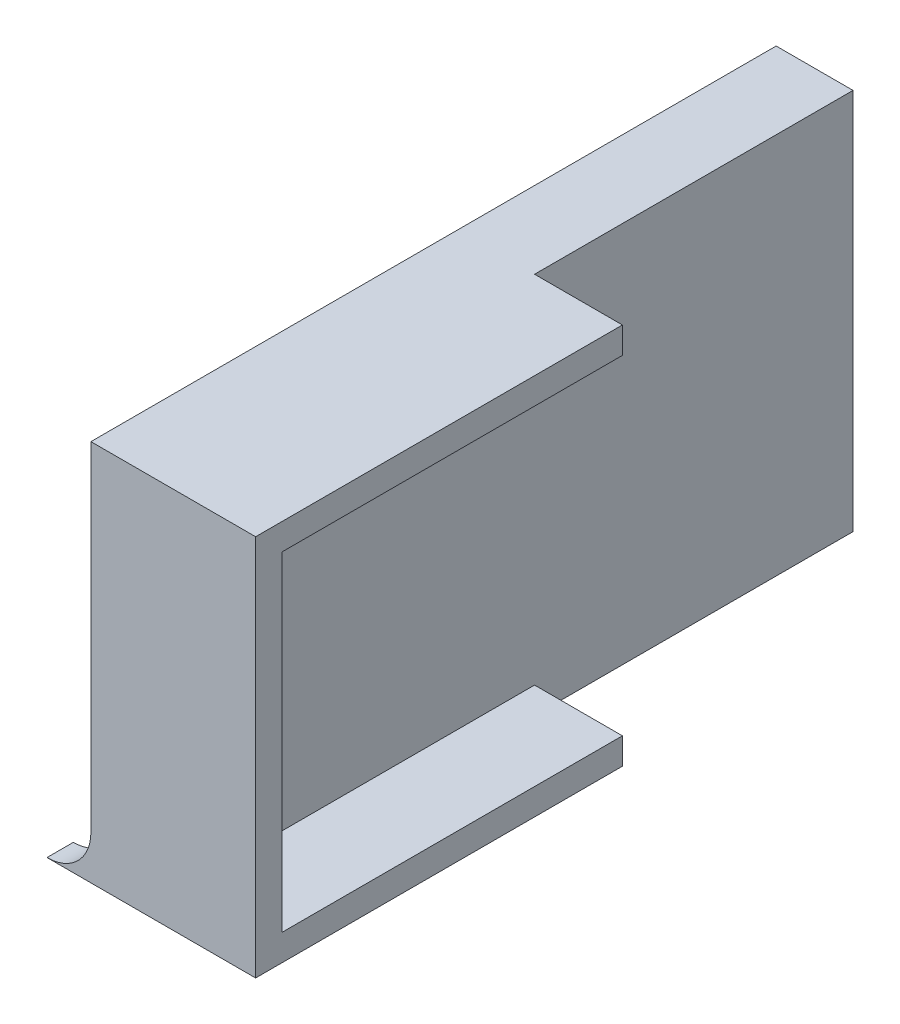
ISO-10303-21;
HEADER;
FILE_DESCRIPTION(('STEP AP214'),'2;1');
FILE_NAME('part.step','',(''),(''),'','','');
FILE_SCHEMA(('AUTOMOTIVE_DESIGN { 1 0 10303 214 1 1 1 1 }'));
ENDSEC;
DATA;
#1=APPLICATION_CONTEXT('core data for automotive mechanical design processes');
#2=APPLICATION_PROTOCOL_DEFINITION('international standard','automotive_design',2000,#1);
#3=PRODUCT_CONTEXT('',#1,'mechanical');
#4=PRODUCT('Part','Part','',(#3));
#5=PRODUCT_RELATED_PRODUCT_CATEGORY('part','',(#4));
#6=PRODUCT_DEFINITION_FORMATION('','',#4);
#7=PRODUCT_DEFINITION_CONTEXT('part definition',#1,'design');
#8=PRODUCT_DEFINITION('design','',#6,#7);
#9=PRODUCT_DEFINITION_SHAPE('','',#8);
#10=(LENGTH_UNIT() NAMED_UNIT(*) SI_UNIT(.MILLI.,.METRE.));
#11=(NAMED_UNIT(*) PLANE_ANGLE_UNIT() SI_UNIT($,.RADIAN.));
#12=(NAMED_UNIT(*) SI_UNIT($,.STERADIAN.) SOLID_ANGLE_UNIT());
#13=UNCERTAINTY_MEASURE_WITH_UNIT(LENGTH_MEASURE(1.E-05),#10,'distance_accuracy_value','');
#14=(GEOMETRIC_REPRESENTATION_CONTEXT(3) GLOBAL_UNCERTAINTY_ASSIGNED_CONTEXT((#13)) GLOBAL_UNIT_ASSIGNED_CONTEXT((#10,
#11,#12)) REPRESENTATION_CONTEXT('',''));
#15=CARTESIAN_POINT('',(0.,0.,0.));
#16=DIRECTION('',(0.,0.,1.));
#17=DIRECTION('',(1.,0.,0.));
#18=AXIS2_PLACEMENT_3D('',#15,#16,#17);
#19=CARTESIAN_POINT('',(0.,0.,-2.8));
#20=DIRECTION('',(0.,0.,-1.));
#21=DIRECTION('',(-1.,0.,0.));
#22=AXIS2_PLACEMENT_3D('',#19,#20,#21);
#23=PLANE('',#22);
#24=CARTESIAN_POINT('',(-118.5,65.8,-2.8));
#25=DIRECTION('',(0.,0.,-1.));
#26=DIRECTION('',(-1.,0.,0.));
#27=AXIS2_PLACEMENT_3D('',#24,#25,#26);
#28=CIRCLE('',#27,2.);
#29=CARTESIAN_POINT('',(-118.5,63.8,-2.8));
#30=VERTEX_POINT('',#29);
#31=CARTESIAN_POINT('',(-116.5,65.8,-2.8));
#32=VERTEX_POINT('',#31);
#33=EDGE_CURVE('E145',#30,#32,#28,.F.);
#34=ORIENTED_EDGE('',*,*,#33,.F.);
#35=DIRECTION('',(-1.,0.,0.));
#36=VECTOR('',#35,1.);
#37=CARTESIAN_POINT('',(-118.5,63.8,-2.8));
#38=LINE('',#37,#36);
#39=CARTESIAN_POINT('',(-109.,63.8,-2.8));
#40=VERTEX_POINT('',#39);
#41=EDGE_CURVE('E173',#40,#30,#38,.T.);
#42=ORIENTED_EDGE('',*,*,#41,.F.);
#43=DIRECTION('',(0.,-1.,0.));
#44=VECTOR('',#43,1.);
#45=CARTESIAN_POINT('',(-109.,63.8,-2.8));
#46=LINE('',#45,#44);
#47=CARTESIAN_POINT('',(-109.,81.2,-2.8));
#48=VERTEX_POINT('',#47);
#49=EDGE_CURVE('E183',#48,#40,#46,.T.);
#50=ORIENTED_EDGE('',*,*,#49,.F.);
#51=DIRECTION('',(1.,0.,0.));
#52=VECTOR('',#51,1.);
#53=CARTESIAN_POINT('',(-118.5,81.2,-2.8));
#54=LINE('',#53,#52);
#55=CARTESIAN_POINT('',(-116.5,81.2,-2.8));
#56=VERTEX_POINT('',#55);
#57=EDGE_CURVE('E180',#56,#48,#54,.T.);
#58=ORIENTED_EDGE('',*,*,#57,.F.);
#59=DIRECTION('',(0.,-1.,0.));
#60=VECTOR('',#59,1.);
#61=CARTESIAN_POINT('',(-116.5,84.,-2.8));
#62=LINE('',#61,#60);
#63=EDGE_CURVE('E195',#56,#32,#62,.T.);
#64=ORIENTED_EDGE('',*,*,#63,.T.);
#65=EDGE_LOOP('',(#34,#42,#50,#58,#64));
#66=FACE_BOUND('',#65,.T.);
#67=ADVANCED_FACE('F35',(#66),#23,.F.);
#68=CARTESIAN_POINT('',(-109.,63.8,-2.8));
#69=DIRECTION('',(0.,-1.,0.));
#70=DIRECTION('',(-1.,0.,0.));
#71=AXIS2_PLACEMENT_3D('',#68,#69,#70);
#72=PLANE('',#71);
#73=DIRECTION('',(-1.,0.,0.));
#74=VECTOR('',#73,1.);
#75=CARTESIAN_POINT('',(0.,63.8,-4.));
#76=LINE('',#75,#74);
#77=CARTESIAN_POINT('',(-116.5,63.8,-4.));
#78=VERTEX_POINT('',#77);
#79=CARTESIAN_POINT('',(-118.5,63.8,-4.));
#80=VERTEX_POINT('',#79);
#81=EDGE_CURVE('E193',#78,#80,#76,.T.);
#82=ORIENTED_EDGE('',*,*,#81,.F.);
#83=DIRECTION('',(0.,0.,1.));
#84=VECTOR('',#83,1.);
#85=CARTESIAN_POINT('',(-116.5,63.8,-34.));
#86=LINE('',#85,#84);
#87=CARTESIAN_POINT('',(-116.5,63.8,-34.));
#88=VERTEX_POINT('',#87);
#89=EDGE_CURVE('E167',#88,#78,#86,.T.);
#90=ORIENTED_EDGE('',*,*,#89,.F.);
#91=DIRECTION('',(1.,0.,0.));
#92=VECTOR('',#91,1.);
#93=CARTESIAN_POINT('',(-125.,63.8,-34.));
#94=LINE('',#93,#92);
#95=CARTESIAN_POINT('',(-113.,63.8,-34.));
#96=VERTEX_POINT('',#95);
#97=EDGE_CURVE('E246',#88,#96,#94,.T.);
#98=ORIENTED_EDGE('',*,*,#97,.T.);
#99=DIRECTION('',(0.,0.,1.));
#100=VECTOR('',#99,1.);
#101=CARTESIAN_POINT('',(-113.,63.8,-46.0598507453451));
#102=LINE('',#101,#100);
#103=CARTESIAN_POINT('',(-113.,63.8,-19.5));
#104=VERTEX_POINT('',#103);
#105=EDGE_CURVE('E249',#96,#104,#102,.T.);
#106=ORIENTED_EDGE('',*,*,#105,.T.);
#107=DIRECTION('',(-1.,0.,0.));
#108=VECTOR('',#107,1.);
#109=CARTESIAN_POINT('',(-125.,63.8,-19.5));
#110=LINE('',#109,#108);
#111=CARTESIAN_POINT('',(-109.,63.8,-19.5));
#112=VERTEX_POINT('',#111);
#113=EDGE_CURVE('E245',#112,#104,#110,.T.);
#114=ORIENTED_EDGE('',*,*,#113,.F.);
#115=DIRECTION('',(0.,0.,-1.));
#116=VECTOR('',#115,1.);
#117=CARTESIAN_POINT('',(-109.,63.8,-18.4));
#118=LINE('',#117,#116);
#119=EDGE_CURVE('E11',#40,#112,#118,.T.);
#120=ORIENTED_EDGE('',*,*,#119,.F.);
#121=ORIENTED_EDGE('',*,*,#41,.T.);
#122=DIRECTION('',(0.,0.,-1.));
#123=VECTOR('',#122,1.);
#124=CARTESIAN_POINT('',(-118.5,63.8,0.));
#125=LINE('',#124,#123);
#126=EDGE_CURVE('E197',#30,#80,#125,.T.);
#127=ORIENTED_EDGE('',*,*,#126,.T.);
#128=EDGE_LOOP('',(#82,#90,#98,#106,#114,#120,#121,#127));
#129=FACE_BOUND('',#128,.T.);
#130=ADVANCED_FACE('F206',(#129),#72,.T.);
#131=CARTESIAN_POINT('',(-109.,81.2,-2.8));
#132=DIRECTION('',(1.,0.,0.));
#133=DIRECTION('',(0.,-1.,0.));
#134=AXIS2_PLACEMENT_3D('',#131,#132,#133);
#135=PLANE('',#134);
#136=DIRECTION('',(0.,-1.,0.));
#137=VECTOR('',#136,1.);
#138=CARTESIAN_POINT('',(-109.,0.,-4.));
#139=LINE('',#138,#137);
#140=CARTESIAN_POINT('',(-109.,80.,-4.));
#141=VERTEX_POINT('',#140);
#142=CARTESIAN_POINT('',(-109.,65.,-4.));
#143=VERTEX_POINT('',#142);
#144=EDGE_CURVE('E190',#141,#143,#139,.T.);
#145=ORIENTED_EDGE('',*,*,#144,.F.);
#146=DIRECTION('',(0.,0.,1.));
#147=VECTOR('',#146,1.);
#148=CARTESIAN_POINT('',(-109.,80.,-19.5));
#149=LINE('',#148,#147);
#150=CARTESIAN_POINT('',(-109.,80.,-19.5));
#151=VERTEX_POINT('',#150);
#152=EDGE_CURVE('E270',#151,#141,#149,.T.);
#153=ORIENTED_EDGE('',*,*,#152,.F.);
#154=DIRECTION('',(0.,-1.,0.));
#155=VECTOR('',#154,1.);
#156=CARTESIAN_POINT('',(-109.,81.2,-19.5));
#157=LINE('',#156,#155);
#158=CARTESIAN_POINT('',(-109.,81.2,-19.5));
#159=VERTEX_POINT('',#158);
#160=EDGE_CURVE('E265',#159,#151,#157,.T.);
#161=ORIENTED_EDGE('',*,*,#160,.F.);
#162=DIRECTION('',(0.,0.,-1.));
#163=VECTOR('',#162,1.);
#164=CARTESIAN_POINT('',(-109.,81.2,-18.4));
#165=LINE('',#164,#163);
#166=EDGE_CURVE('E45',#48,#159,#165,.T.);
#167=ORIENTED_EDGE('',*,*,#166,.F.);
#168=ORIENTED_EDGE('',*,*,#49,.T.);
#169=ORIENTED_EDGE('',*,*,#119,.T.);
#170=DIRECTION('',(0.,-1.,0.));
#171=VECTOR('',#170,1.);
#172=CARTESIAN_POINT('',(-109.,65.,-19.5));
#173=LINE('',#172,#171);
#174=CARTESIAN_POINT('',(-109.,65.,-19.5));
#175=VERTEX_POINT('',#174);
#176=EDGE_CURVE('E255',#175,#112,#173,.T.);
#177=ORIENTED_EDGE('',*,*,#176,.F.);
#178=DIRECTION('',(0.,0.,1.));
#179=VECTOR('',#178,1.);
#180=CARTESIAN_POINT('',(-109.,65.,-19.5));
#181=LINE('',#180,#179);
#182=EDGE_CURVE('E157',#175,#143,#181,.T.);
#183=ORIENTED_EDGE('',*,*,#182,.T.);
#184=EDGE_LOOP('',(#145,#153,#161,#167,#168,#169,#177,#183));
#185=FACE_BOUND('',#184,.T.);
#186=ADVANCED_FACE('F315',(#185),#135,.T.);
#187=CARTESIAN_POINT('',(-118.5,81.2,-2.8));
#188=DIRECTION('',(0.,1.,0.));
#189=DIRECTION('',(1.,0.,0.));
#190=AXIS2_PLACEMENT_3D('',#187,#188,#189);
#191=PLANE('',#190);
#192=ORIENTED_EDGE('',*,*,#166,.T.);
#193=DIRECTION('',(1.,0.,0.));
#194=VECTOR('',#193,1.);
#195=CARTESIAN_POINT('',(-125.,81.2,-19.5));
#196=LINE('',#195,#194);
#197=CARTESIAN_POINT('',(-113.,81.2,-19.5));
#198=VERTEX_POINT('',#197);
#199=EDGE_CURVE('E267',#198,#159,#196,.T.);
#200=ORIENTED_EDGE('',*,*,#199,.F.);
#201=DIRECTION('',(0.,0.,1.));
#202=VECTOR('',#201,1.);
#203=CARTESIAN_POINT('',(-113.,81.2,-46.0598507453451));
#204=LINE('',#203,#202);
#205=CARTESIAN_POINT('',(-113.,81.2,-34.));
#206=VERTEX_POINT('',#205);
#207=EDGE_CURVE('E240',#206,#198,#204,.T.);
#208=ORIENTED_EDGE('',*,*,#207,.F.);
#209=DIRECTION('',(-1.,0.,0.));
#210=VECTOR('',#209,1.);
#211=CARTESIAN_POINT('',(-125.,81.2,-34.));
#212=LINE('',#211,#210);
#213=CARTESIAN_POINT('',(-116.5,81.2,-34.));
#214=VERTEX_POINT('',#213);
#215=EDGE_CURVE('E233',#206,#214,#212,.T.);
#216=ORIENTED_EDGE('',*,*,#215,.T.);
#217=DIRECTION('',(0.,0.,-1.));
#218=VECTOR('',#217,1.);
#219=CARTESIAN_POINT('',(-116.5,81.2,-19.5));
#220=LINE('',#219,#218);
#221=EDGE_CURVE('E166',#56,#214,#220,.T.);
#222=ORIENTED_EDGE('',*,*,#221,.F.);
#223=ORIENTED_EDGE('',*,*,#57,.T.);
#224=EDGE_LOOP('',(#192,#200,#208,#216,#222,#223));
#225=FACE_BOUND('',#224,.T.);
#226=ADVANCED_FACE('F332',(#225),#191,.T.);
#227=CARTESIAN_POINT('',(0.,0.,-19.5));
#228=DIRECTION('',(0.,0.,-1.));
#229=DIRECTION('',(1.,0.,0.));
#230=AXIS2_PLACEMENT_3D('',#227,#228,#229);
#231=PLANE('',#230);
#232=ORIENTED_EDGE('',*,*,#113,.T.);
#233=DIRECTION('',(0.,-1.,0.));
#234=VECTOR('',#233,1.);
#235=CARTESIAN_POINT('',(-113.,63.8,-19.5));
#236=LINE('',#235,#234);
#237=CARTESIAN_POINT('',(-113.,65.,-19.5));
#238=VERTEX_POINT('',#237);
#239=EDGE_CURVE('E236',#238,#104,#236,.T.);
#240=ORIENTED_EDGE('',*,*,#239,.F.);
#241=DIRECTION('',(1.,0.,0.));
#242=VECTOR('',#241,1.);
#243=CARTESIAN_POINT('',(-125.,65.,-19.5));
#244=LINE('',#243,#242);
#245=EDGE_CURVE('E258',#238,#175,#244,.T.);
#246=ORIENTED_EDGE('',*,*,#245,.T.);
#247=ORIENTED_EDGE('',*,*,#176,.T.);
#248=EDGE_LOOP('',(#232,#240,#246,#247));
#249=FACE_BOUND('',#248,.T.);
#250=ADVANCED_FACE('F311',(#249),#231,.T.);
#251=CARTESIAN_POINT('',(0.,0.,-19.5));
#252=DIRECTION('',(0.,0.,-1.));
#253=DIRECTION('',(1.,0.,0.));
#254=AXIS2_PLACEMENT_3D('',#251,#252,#253);
#255=PLANE('',#254);
#256=DIRECTION('',(-1.,0.,0.));
#257=VECTOR('',#256,1.);
#258=CARTESIAN_POINT('',(-125.,80.,-19.5));
#259=LINE('',#258,#257);
#260=CARTESIAN_POINT('',(-113.,80.,-19.5));
#261=VERTEX_POINT('',#260);
#262=EDGE_CURVE('E262',#151,#261,#259,.T.);
#263=ORIENTED_EDGE('',*,*,#262,.T.);
#264=DIRECTION('',(0.,-1.,0.));
#265=VECTOR('',#264,1.);
#266=CARTESIAN_POINT('',(-113.,81.2,-19.5));
#267=LINE('',#266,#265);
#268=EDGE_CURVE('E232',#198,#261,#267,.T.);
#269=ORIENTED_EDGE('',*,*,#268,.F.);
#270=ORIENTED_EDGE('',*,*,#199,.T.);
#271=ORIENTED_EDGE('',*,*,#160,.T.);
#272=EDGE_LOOP('',(#263,#269,#270,#271));
#273=FACE_BOUND('',#272,.T.);
#274=ADVANCED_FACE('F328',(#273),#255,.T.);
#275=CARTESIAN_POINT('',(-115.,80.,-34.));
#276=DIRECTION('',(-1.,0.,0.));
#277=DIRECTION('',(0.,0.,1.));
#278=AXIS2_PLACEMENT_3D('',#275,#276,#277);
#279=PLANE('',#278);
#280=DIRECTION('',(0.,0.,1.));
#281=VECTOR('',#280,1.);
#282=CARTESIAN_POINT('',(-115.,65.,-34.));
#283=LINE('',#282,#281);
#284=CARTESIAN_POINT('',(-115.,65.,-34.));
#285=VERTEX_POINT('',#284);
#286=CARTESIAN_POINT('',(-115.,65.,-4.));
#287=VERTEX_POINT('',#286);
#288=EDGE_CURVE('E281',#285,#287,#283,.T.);
#289=ORIENTED_EDGE('',*,*,#288,.T.);
#290=DIRECTION('',(0.,1.,0.));
#291=VECTOR('',#290,1.);
#292=CARTESIAN_POINT('',(-115.,0.,-4.));
#293=LINE('',#292,#291);
#294=CARTESIAN_POINT('',(-115.,80.,-4.));
#295=VERTEX_POINT('',#294);
#296=EDGE_CURVE('E153',#287,#295,#293,.T.);
#297=ORIENTED_EDGE('',*,*,#296,.T.);
#298=DIRECTION('',(0.,0.,1.));
#299=VECTOR('',#298,1.);
#300=CARTESIAN_POINT('',(-115.,80.,-34.));
#301=LINE('',#300,#299);
#302=CARTESIAN_POINT('',(-115.,80.,-34.));
#303=VERTEX_POINT('',#302);
#304=EDGE_CURVE('E282',#303,#295,#301,.T.);
#305=ORIENTED_EDGE('',*,*,#304,.F.);
#306=DIRECTION('',(0.,-1.,0.));
#307=VECTOR('',#306,1.);
#308=CARTESIAN_POINT('',(-115.,80.,-34.));
#309=LINE('',#308,#307);
#310=EDGE_CURVE('E277',#303,#285,#309,.T.);
#311=ORIENTED_EDGE('',*,*,#310,.T.);
#312=EDGE_LOOP('',(#289,#297,#305,#311));
#313=FACE_BOUND('',#312,.T.);
#314=ADVANCED_FACE('F298',(#313),#279,.T.);
#315=CARTESIAN_POINT('',(-125.,65.,-19.5));
#316=DIRECTION('',(0.,-1.,0.));
#317=DIRECTION('',(0.,0.,-1.));
#318=AXIS2_PLACEMENT_3D('',#315,#316,#317);
#319=PLANE('',#318);
#320=DIRECTION('',(0.,0.,-1.));
#321=VECTOR('',#320,1.);
#322=CARTESIAN_POINT('',(-116.5,65.,-19.5));
#323=LINE('',#322,#321);
#324=CARTESIAN_POINT('',(-116.5,65.,-4.));
#325=VERTEX_POINT('',#324);
#326=CARTESIAN_POINT('',(-116.5,65.,-34.));
#327=VERTEX_POINT('',#326);
#328=EDGE_CURVE('E160',#325,#327,#323,.T.);
#329=ORIENTED_EDGE('',*,*,#328,.F.);
#330=DIRECTION('',(-1.,0.,0.));
#331=VECTOR('',#330,1.);
#332=CARTESIAN_POINT('',(0.,65.,-4.));
#333=LINE('',#332,#331);
#334=EDGE_CURVE('E149',#287,#325,#333,.T.);
#335=ORIENTED_EDGE('',*,*,#334,.F.);
#336=ORIENTED_EDGE('',*,*,#288,.F.);
#337=DIRECTION('',(-1.,0.,0.));
#338=VECTOR('',#337,1.);
#339=CARTESIAN_POINT('',(-125.,65.,-34.));
#340=LINE('',#339,#338);
#341=EDGE_CURVE('E163',#285,#327,#340,.T.);
#342=ORIENTED_EDGE('',*,*,#341,.T.);
#343=EDGE_LOOP('',(#329,#335,#336,#342));
#344=FACE_BOUND('',#343,.T.);
#345=ADVANCED_FACE('F161',(#344),#319,.F.);
#346=CARTESIAN_POINT('',(-113.,80.,-34.));
#347=DIRECTION('',(1.,0.,0.));
#348=DIRECTION('',(0.,0.,-1.));
#349=AXIS2_PLACEMENT_3D('',#346,#347,#348);
#350=PLANE('',#349);
#351=DIRECTION('',(0.,1.,0.));
#352=VECTOR('',#351,1.);
#353=CARTESIAN_POINT('',(-113.,80.,-34.));
#354=LINE('',#353,#352);
#355=EDGE_CURVE('E279',#96,#206,#354,.T.);
#356=ORIENTED_EDGE('',*,*,#355,.T.);
#357=ORIENTED_EDGE('',*,*,#207,.T.);
#358=ORIENTED_EDGE('',*,*,#268,.T.);
#359=DIRECTION('',(0.,0.,1.));
#360=VECTOR('',#359,1.);
#361=CARTESIAN_POINT('',(-113.,80.,-34.));
#362=LINE('',#361,#360);
#363=CARTESIAN_POINT('',(-113.,80.,-4.));
#364=VERTEX_POINT('',#363);
#365=EDGE_CURVE('E286',#261,#364,#362,.T.);
#366=ORIENTED_EDGE('',*,*,#365,.T.);
#367=DIRECTION('',(0.,-1.,0.));
#368=VECTOR('',#367,1.);
#369=CARTESIAN_POINT('',(-113.,0.,-4.));
#370=LINE('',#369,#368);
#371=CARTESIAN_POINT('',(-113.,65.,-4.));
#372=VERTEX_POINT('',#371);
#373=EDGE_CURVE('E285',#364,#372,#370,.T.);
#374=ORIENTED_EDGE('',*,*,#373,.T.);
#375=DIRECTION('',(0.,0.,1.));
#376=VECTOR('',#375,1.);
#377=CARTESIAN_POINT('',(-113.,65.,-34.));
#378=LINE('',#377,#376);
#379=EDGE_CURVE('E289',#238,#372,#378,.T.);
#380=ORIENTED_EDGE('',*,*,#379,.F.);
#381=ORIENTED_EDGE('',*,*,#239,.T.);
#382=ORIENTED_EDGE('',*,*,#105,.F.);
#383=EDGE_LOOP('',(#356,#357,#358,#366,#374,#380,#381,#382));
#384=FACE_BOUND('',#383,.T.);
#385=ADVANCED_FACE('F308',(#384),#350,.T.);
#386=EDGE_CURVE('E156',#143,#372,#333,.T.);
#387=ORIENTED_EDGE('',*,*,#386,.F.);
#388=ORIENTED_EDGE('',*,*,#182,.F.);
#389=ORIENTED_EDGE('',*,*,#245,.F.);
#390=ORIENTED_EDGE('',*,*,#379,.T.);
#391=EDGE_LOOP('',(#387,#388,#389,#390));
#392=FACE_BOUND('',#391,.T.);
#393=ADVANCED_FACE('F320',(#392),#319,.F.);
#394=CARTESIAN_POINT('',(-125.,80.,-19.5));
#395=DIRECTION('',(0.,1.,0.));
#396=DIRECTION('',(0.,0.,1.));
#397=AXIS2_PLACEMENT_3D('',#394,#395,#396);
#398=PLANE('',#397);
#399=DIRECTION('',(1.,0.,0.));
#400=VECTOR('',#399,1.);
#401=CARTESIAN_POINT('',(0.,80.,-4.));
#402=LINE('',#401,#400);
#403=EDGE_CURVE('E273',#364,#141,#402,.T.);
#404=ORIENTED_EDGE('',*,*,#403,.F.);
#405=ORIENTED_EDGE('',*,*,#365,.F.);
#406=ORIENTED_EDGE('',*,*,#262,.F.);
#407=ORIENTED_EDGE('',*,*,#152,.T.);
#408=EDGE_LOOP('',(#404,#405,#406,#407));
#409=FACE_BOUND('',#408,.T.);
#410=ADVANCED_FACE('F326',(#409),#398,.F.);
#411=CARTESIAN_POINT('',(0.,0.,-4.));
#412=DIRECTION('',(0.,0.,-1.));
#413=DIRECTION('',(-1.,0.,0.));
#414=AXIS2_PLACEMENT_3D('',#411,#412,#413);
#415=PLANE('',#414);
#416=ORIENTED_EDGE('',*,*,#403,.T.);
#417=ORIENTED_EDGE('',*,*,#144,.T.);
#418=ORIENTED_EDGE('',*,*,#386,.T.);
#419=ORIENTED_EDGE('',*,*,#373,.F.);
#420=EDGE_LOOP('',(#416,#417,#418,#419));
#421=FACE_BOUND('',#420,.T.);
#422=ADVANCED_FACE('F322',(#421),#415,.T.);
#423=CARTESIAN_POINT('',(-116.5,84.,-34.));
#424=DIRECTION('',(-1.,0.,0.));
#425=DIRECTION('',(0.,0.,1.));
#426=AXIS2_PLACEMENT_3D('',#423,#424,#425);
#427=PLANE('',#426);
#428=ORIENTED_EDGE('',*,*,#89,.T.);
#429=DIRECTION('',(0.,1.,0.));
#430=VECTOR('',#429,1.);
#431=CARTESIAN_POINT('',(-116.5,0.,-4.));
#432=LINE('',#431,#430);
#433=EDGE_CURVE('E140',#78,#325,#432,.T.);
#434=ORIENTED_EDGE('',*,*,#433,.T.);
#435=ORIENTED_EDGE('',*,*,#328,.T.);
#436=DIRECTION('',(0.,-1.,0.));
#437=VECTOR('',#436,1.);
#438=CARTESIAN_POINT('',(-116.5,84.,-34.));
#439=LINE('',#438,#437);
#440=EDGE_CURVE('E225',#327,#88,#439,.T.);
#441=ORIENTED_EDGE('',*,*,#440,.T.);
#442=EDGE_LOOP('',(#428,#434,#435,#441));
#443=FACE_BOUND('',#442,.T.);
#444=ADVANCED_FACE('F170',(#443),#427,.T.);
#445=ORIENTED_EDGE('',*,*,#433,.F.);
#446=ORIENTED_EDGE('',*,*,#81,.T.);
#447=CARTESIAN_POINT('',(-118.5,65.8,-4.));
#448=DIRECTION('',(0.,0.,-1.));
#449=DIRECTION('',(-1.,0.,0.));
#450=AXIS2_PLACEMENT_3D('',#447,#448,#449);
#451=CIRCLE('',#450,2.);
#452=CARTESIAN_POINT('',(-116.5,65.8,-4.));
#453=VERTEX_POINT('',#452);
#454=EDGE_CURVE('E132',#80,#453,#451,.F.);
#455=ORIENTED_EDGE('',*,*,#454,.T.);
#456=DIRECTION('',(0.,-1.,0.));
#457=VECTOR('',#456,1.);
#458=CARTESIAN_POINT('',(-116.5,84.,-4.));
#459=LINE('',#458,#457);
#460=EDGE_CURVE('E135',#453,#325,#459,.T.);
#461=ORIENTED_EDGE('',*,*,#460,.T.);
#462=EDGE_LOOP('',(#445,#446,#455,#461));
#463=FACE_BOUND('',#462,.T.);
#464=ADVANCED_FACE('F137',(#463),#415,.T.);
#465=CARTESIAN_POINT('',(-118.5,65.8,0.));
#466=DIRECTION('',(0.,0.,-1.));
#467=DIRECTION('',(-1.,0.,0.));
#468=AXIS2_PLACEMENT_3D('',#465,#466,#467);
#469=CYLINDRICAL_SURFACE('',#468,2.);
#470=ORIENTED_EDGE('',*,*,#126,.F.);
#471=ORIENTED_EDGE('',*,*,#33,.T.);
#472=DIRECTION('',(0.,0.,-1.));
#473=VECTOR('',#472,1.);
#474=CARTESIAN_POINT('',(-116.5,65.8,-34.));
#475=LINE('',#474,#473);
#476=EDGE_CURVE('E39',#453,#32,#475,.F.);
#477=ORIENTED_EDGE('',*,*,#476,.F.);
#478=ORIENTED_EDGE('',*,*,#454,.F.);
#479=EDGE_LOOP('',(#470,#471,#477,#478));
#480=FACE_BOUND('',#479,.T.);
#481=ADVANCED_FACE('F212',(#480),#469,.F.);
#482=CARTESIAN_POINT('',(-116.5,80.,-4.));
#483=VERTEX_POINT('',#482);
#484=EDGE_CURVE('E144',#483,#453,#459,.T.);
#485=ORIENTED_EDGE('',*,*,#484,.F.);
#486=EDGE_CURVE('E276',#483,#295,#402,.T.);
#487=ORIENTED_EDGE('',*,*,#486,.T.);
#488=ORIENTED_EDGE('',*,*,#296,.F.);
#489=ORIENTED_EDGE('',*,*,#334,.T.);
#490=ORIENTED_EDGE('',*,*,#460,.F.);
#491=EDGE_LOOP('',(#485,#487,#488,#489,#490));
#492=FACE_BOUND('',#491,.T.);
#493=ADVANCED_FACE('F151',(#492),#415,.T.);
#494=DIRECTION('',(0.,0.,1.));
#495=VECTOR('',#494,1.);
#496=CARTESIAN_POINT('',(-116.5,80.,-19.5));
#497=LINE('',#496,#495);
#498=CARTESIAN_POINT('',(-116.5,80.,-34.));
#499=VERTEX_POINT('',#498);
#500=EDGE_CURVE('E223',#499,#483,#497,.T.);
#501=ORIENTED_EDGE('',*,*,#500,.F.);
#502=DIRECTION('',(1.,0.,0.));
#503=VECTOR('',#502,1.);
#504=CARTESIAN_POINT('',(-125.,80.,-34.));
#505=LINE('',#504,#503);
#506=EDGE_CURVE('E237',#499,#303,#505,.T.);
#507=ORIENTED_EDGE('',*,*,#506,.T.);
#508=ORIENTED_EDGE('',*,*,#304,.T.);
#509=ORIENTED_EDGE('',*,*,#486,.F.);
#510=EDGE_LOOP('',(#501,#507,#508,#509));
#511=FACE_BOUND('',#510,.T.);
#512=ADVANCED_FACE('F334',(#511),#398,.F.);
#513=CARTESIAN_POINT('',(0.,0.,-34.));
#514=DIRECTION('',(0.,0.,1.));
#515=DIRECTION('',(1.,0.,0.));
#516=AXIS2_PLACEMENT_3D('',#513,#514,#515);
#517=PLANE('',#516);
#518=EDGE_CURVE('E226',#214,#499,#439,.T.);
#519=ORIENTED_EDGE('',*,*,#518,.F.);
#520=ORIENTED_EDGE('',*,*,#215,.F.);
#521=ORIENTED_EDGE('',*,*,#355,.F.);
#522=ORIENTED_EDGE('',*,*,#97,.F.);
#523=ORIENTED_EDGE('',*,*,#440,.F.);
#524=ORIENTED_EDGE('',*,*,#341,.F.);
#525=ORIENTED_EDGE('',*,*,#310,.F.);
#526=ORIENTED_EDGE('',*,*,#506,.F.);
#527=EDGE_LOOP('',(#519,#520,#521,#522,#523,#524,#525,#526));
#528=FACE_BOUND('',#527,.T.);
#529=ADVANCED_FACE('F301',(#528),#517,.F.);
#530=ORIENTED_EDGE('',*,*,#63,.F.);
#531=ORIENTED_EDGE('',*,*,#221,.T.);
#532=ORIENTED_EDGE('',*,*,#518,.T.);
#533=ORIENTED_EDGE('',*,*,#500,.T.);
#534=ORIENTED_EDGE('',*,*,#484,.T.);
#535=ORIENTED_EDGE('',*,*,#476,.T.);
#536=EDGE_LOOP('',(#530,#531,#532,#533,#534,#535));
#537=FACE_BOUND('',#536,.T.);
#538=ADVANCED_FACE('F37',(#537),#427,.T.);
#539=CLOSED_SHELL('',(#67,#130,#186,#226,#250,#274,#314,#345,#385,#393,#410,#422,#444,#464,#481,
#493,#512,#529,#538));
#540=MANIFOLD_SOLID_BREP('B2',#539);
#541=ADVANCED_BREP_SHAPE_REPRESENTATION('',(#18,#540),#14);
#542=SHAPE_DEFINITION_REPRESENTATION(#9,#541);
ENDSEC;
END-ISO-10303-21;
